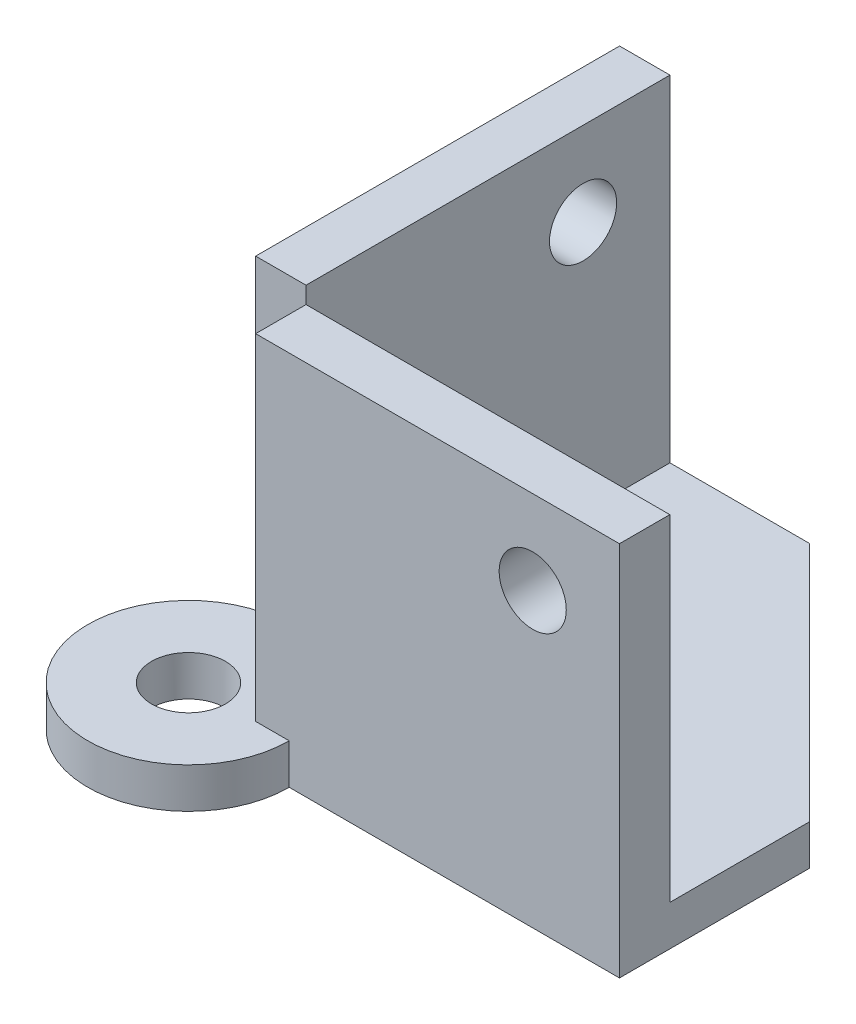
ISO-10303-21;
HEADER;
FILE_DESCRIPTION(('STEP AP214'),'2;1');
FILE_NAME('part.step','',(''),(''),'','','');
FILE_SCHEMA(('AUTOMOTIVE_DESIGN { 1 0 10303 214 1 1 1 1 }'));
ENDSEC;
DATA;
#1=APPLICATION_CONTEXT('core data for automotive mechanical design processes');
#2=APPLICATION_PROTOCOL_DEFINITION('international standard','automotive_design',2000,#1);
#3=PRODUCT_CONTEXT('',#1,'mechanical');
#4=PRODUCT('Part','Part','',(#3));
#5=PRODUCT_RELATED_PRODUCT_CATEGORY('part','',(#4));
#6=PRODUCT_DEFINITION_FORMATION('','',#4);
#7=PRODUCT_DEFINITION_CONTEXT('part definition',#1,'design');
#8=PRODUCT_DEFINITION('design','',#6,#7);
#9=PRODUCT_DEFINITION_SHAPE('','',#8);
#10=(LENGTH_UNIT() NAMED_UNIT(*) SI_UNIT(.MILLI.,.METRE.));
#11=(NAMED_UNIT(*) PLANE_ANGLE_UNIT() SI_UNIT($,.RADIAN.));
#12=(NAMED_UNIT(*) SI_UNIT($,.STERADIAN.) SOLID_ANGLE_UNIT());
#13=UNCERTAINTY_MEASURE_WITH_UNIT(LENGTH_MEASURE(1.E-05),#10,'distance_accuracy_value','');
#14=(GEOMETRIC_REPRESENTATION_CONTEXT(3) GLOBAL_UNCERTAINTY_ASSIGNED_CONTEXT((#13)) GLOBAL_UNIT_ASSIGNED_CONTEXT((#10,
#11,#12)) REPRESENTATION_CONTEXT('',''));
#15=CARTESIAN_POINT('',(0.,0.,0.));
#16=DIRECTION('',(0.,0.,1.));
#17=DIRECTION('',(1.,0.,0.));
#18=AXIS2_PLACEMENT_3D('',#15,#16,#17);
#19=CARTESIAN_POINT('',(0.,20.,0.));
#20=DIRECTION('',(0.,-1.,0.));
#21=DIRECTION('',(0.,0.,-1.));
#22=AXIS2_PLACEMENT_3D('',#19,#20,#21);
#23=PLANE('',#22);
#24=DIRECTION('',(0.,0.,-1.));
#25=VECTOR('',#24,1.);
#26=CARTESIAN_POINT('',(-5.,20.,9.));
#27=LINE('',#26,#25);
#28=CARTESIAN_POINT('',(-5.,20.,9.));
#29=VERTEX_POINT('',#28);
#30=CARTESIAN_POINT('',(-5.,20.,5.99999999999999));
#31=VERTEX_POINT('',#30);
#32=EDGE_CURVE('E121',#29,#31,#27,.T.);
#33=ORIENTED_EDGE('',*,*,#32,.F.);
#34=DIRECTION('',(1.,0.,0.));
#35=VECTOR('',#34,1.);
#36=CARTESIAN_POINT('',(16.6668663889152,20.,9.00000000000002));
#37=LINE('',#36,#35);
#38=CARTESIAN_POINT('',(16.6668663889152,20.,9.00000000000002));
#39=VERTEX_POINT('',#38);
#40=EDGE_CURVE('E134',#29,#39,#37,.T.);
#41=ORIENTED_EDGE('',*,*,#40,.T.);
#42=DIRECTION('',(0.,0.,-1.));
#43=VECTOR('',#42,1.);
#44=CARTESIAN_POINT('',(16.6668663889152,20.,6.00000000000004));
#45=LINE('',#44,#43);
#46=CARTESIAN_POINT('',(16.6668663889152,20.,6.00000000000004));
#47=VERTEX_POINT('',#46);
#48=EDGE_CURVE('E145',#39,#47,#45,.T.);
#49=ORIENTED_EDGE('',*,*,#48,.T.);
#50=DIRECTION('',(-1.,0.,0.));
#51=VECTOR('',#50,1.);
#52=CARTESIAN_POINT('',(16.6668663889152,20.,6.00000000000004));
#53=LINE('',#52,#51);
#54=EDGE_CURVE('E137',#47,#31,#53,.T.);
#55=ORIENTED_EDGE('',*,*,#54,.T.);
#56=EDGE_LOOP('',(#33,#41,#49,#55));
#57=FACE_BOUND('',#56,.T.);
#58=ADVANCED_FACE('F34',(#57),#23,.F.);
#59=DIRECTION('',(-1.,0.,0.));
#60=VECTOR('',#59,1.);
#61=CARTESIAN_POINT('',(-9.,20.,4.99999999999999));
#62=LINE('',#61,#60);
#63=CARTESIAN_POINT('',(-6.,20.,4.99999999999999));
#64=VERTEX_POINT('',#63);
#65=CARTESIAN_POINT('',(-9.,20.,4.99999999999999));
#66=VERTEX_POINT('',#65);
#67=EDGE_CURVE('E138',#64,#66,#62,.T.);
#68=ORIENTED_EDGE('',*,*,#67,.F.);
#69=DIRECTION('',(0.,0.,-1.));
#70=VECTOR('',#69,1.);
#71=CARTESIAN_POINT('',(-6.,20.,5.99999999999999));
#72=LINE('',#71,#70);
#73=CARTESIAN_POINT('',(-6.,20.,-16.6732464439974));
#74=VERTEX_POINT('',#73);
#75=EDGE_CURVE('E156',#64,#74,#72,.T.);
#76=ORIENTED_EDGE('',*,*,#75,.T.);
#77=DIRECTION('',(-1.,0.,0.));
#78=VECTOR('',#77,1.);
#79=CARTESIAN_POINT('',(-6.,20.,-16.6732464439974));
#80=LINE('',#79,#78);
#81=CARTESIAN_POINT('',(-9.,20.,-16.6732464439974));
#82=VERTEX_POINT('',#81);
#83=EDGE_CURVE('E50',#74,#82,#80,.T.);
#84=ORIENTED_EDGE('',*,*,#83,.T.);
#85=DIRECTION('',(0.,0.,1.));
#86=VECTOR('',#85,1.);
#87=CARTESIAN_POINT('',(-9.,20.,8.99999999999999));
#88=LINE('',#87,#86);
#89=EDGE_CURVE('E159',#82,#66,#88,.T.);
#90=ORIENTED_EDGE('',*,*,#89,.T.);
#91=EDGE_LOOP('',(#68,#76,#84,#90));
#92=FACE_BOUND('',#91,.T.);
#93=ADVANCED_FACE('F250',(#92),#23,.F.);
#94=CARTESIAN_POINT('',(16.6668663889152,20.,6.00000000000004));
#95=DIRECTION('',(0.,0.,1.));
#96=DIRECTION('',(1.,0.,0.));
#97=AXIS2_PLACEMENT_3D('',#94,#95,#96);
#98=PLANE('',#97);
#99=CARTESIAN_POINT('',(11.5,15.,6.00000000000003));
#100=DIRECTION('',(0.,0.,1.));
#101=DIRECTION('',(1.,0.,0.));
#102=AXIS2_PLACEMENT_3D('',#99,#100,#101);
#103=CIRCLE('',#102,2.);
#104=CARTESIAN_POINT('',(13.5,15.,6.00000000000003));
#105=VERTEX_POINT('',#104);
#106=EDGE_CURVE('E182',#105,#105,#103,.T.);
#107=ORIENTED_EDGE('',*,*,#106,.T.);
#108=EDGE_LOOP('',(#107));
#109=FACE_BOUND('',#108,.T.);
#110=DIRECTION('',(0.,-1.,0.));
#111=VECTOR('',#110,1.);
#112=CARTESIAN_POINT('',(-5.,20.,5.99999999999999));
#113=LINE('',#112,#111);
#114=CARTESIAN_POINT('',(-5.,0.,5.99999999999999));
#115=VERTEX_POINT('',#114);
#116=EDGE_CURVE('E130',#31,#115,#113,.T.);
#117=ORIENTED_EDGE('',*,*,#116,.F.);
#118=ORIENTED_EDGE('',*,*,#54,.F.);
#119=DIRECTION('',(0.,-1.,0.));
#120=VECTOR('',#119,1.);
#121=CARTESIAN_POINT('',(16.6668663889152,20.,6.00000000000004));
#122=LINE('',#121,#120);
#123=CARTESIAN_POINT('',(16.6668663889152,0.,6.00000000000004));
#124=VERTEX_POINT('',#123);
#125=EDGE_CURVE('E169',#47,#124,#122,.T.);
#126=ORIENTED_EDGE('',*,*,#125,.T.);
#127=DIRECTION('',(-1.,0.,0.));
#128=VECTOR('',#127,1.);
#129=CARTESIAN_POINT('',(16.6668663889152,0.,6.00000000000004));
#130=LINE('',#129,#128);
#131=EDGE_CURVE('E149',#124,#115,#130,.T.);
#132=ORIENTED_EDGE('',*,*,#131,.T.);
#133=EDGE_LOOP('',(#117,#118,#126,#132));
#134=FACE_BOUND('',#133,.T.);
#135=ADVANCED_FACE('F255',(#109,#134),#98,.F.);
#136=CARTESIAN_POINT('',(-6.,20.,5.99999999999999));
#137=DIRECTION('',(-1.,0.,0.));
#138=DIRECTION('',(0.,0.,1.));
#139=AXIS2_PLACEMENT_3D('',#136,#137,#138);
#140=PLANE('',#139);
#141=CARTESIAN_POINT('',(-6.,15.,-11.5));
#142=DIRECTION('',(-1.,0.,0.));
#143=DIRECTION('',(0.,0.,1.));
#144=AXIS2_PLACEMENT_3D('',#141,#142,#143);
#145=CIRCLE('',#144,1.99999999999999);
#146=CARTESIAN_POINT('',(-6.,15.,-9.5));
#147=VERTEX_POINT('',#146);
#148=EDGE_CURVE('E186',#147,#147,#145,.T.);
#149=ORIENTED_EDGE('',*,*,#148,.T.);
#150=EDGE_LOOP('',(#149));
#151=FACE_BOUND('',#150,.T.);
#152=DIRECTION('',(0.,1.,0.));
#153=VECTOR('',#152,1.);
#154=CARTESIAN_POINT('',(-6.,20.,4.99999999999999));
#155=LINE('',#154,#153);
#156=CARTESIAN_POINT('',(-6.,0.,4.99999999999999));
#157=VERTEX_POINT('',#156);
#158=EDGE_CURVE('E435',#157,#64,#155,.T.);
#159=ORIENTED_EDGE('',*,*,#158,.F.);
#160=DIRECTION('',(0.,0.,-1.));
#161=VECTOR('',#160,1.);
#162=CARTESIAN_POINT('',(-6.,0.,5.99999999999999));
#163=LINE('',#162,#161);
#164=CARTESIAN_POINT('',(-6.,0.,-16.6732464439974));
#165=VERTEX_POINT('',#164);
#166=EDGE_CURVE('E146',#157,#165,#163,.T.);
#167=ORIENTED_EDGE('',*,*,#166,.T.);
#168=DIRECTION('',(0.,-1.,0.));
#169=VECTOR('',#168,1.);
#170=CARTESIAN_POINT('',(-6.,20.,-16.6732464439974));
#171=LINE('',#170,#169);
#172=EDGE_CURVE('E166',#74,#165,#171,.T.);
#173=ORIENTED_EDGE('',*,*,#172,.F.);
#174=ORIENTED_EDGE('',*,*,#75,.F.);
#175=EDGE_LOOP('',(#159,#167,#173,#174));
#176=FACE_BOUND('',#175,.T.);
#177=ADVANCED_FACE('F260',(#151,#176),#140,.F.);
#178=CARTESIAN_POINT('',(-9.,-2.4,8.99999999999999));
#179=DIRECTION('',(1.,0.,0.));
#180=DIRECTION('',(0.,0.,-1.));
#181=AXIS2_PLACEMENT_3D('',#178,#179,#180);
#182=PLANE('',#181);
#183=CARTESIAN_POINT('',(-9.,15.,-11.5));
#184=DIRECTION('',(1.,0.,0.));
#185=DIRECTION('',(0.,0.,-1.));
#186=AXIS2_PLACEMENT_3D('',#183,#184,#185);
#187=CIRCLE('',#186,1.99999999999999);
#188=CARTESIAN_POINT('',(-9.,15.,-13.5));
#189=VERTEX_POINT('',#188);
#190=EDGE_CURVE('E185',#189,#189,#187,.T.);
#191=ORIENTED_EDGE('',*,*,#190,.T.);
#192=EDGE_LOOP('',(#191));
#193=FACE_BOUND('',#192,.T.);
#194=DIRECTION('',(0.,-1.,0.));
#195=VECTOR('',#194,1.);
#196=CARTESIAN_POINT('',(-9.,20.,4.99999999999999));
#197=LINE('',#196,#195);
#198=CARTESIAN_POINT('',(-9.,0.,4.99999999999999));
#199=VERTEX_POINT('',#198);
#200=EDGE_CURVE('E129',#66,#199,#197,.T.);
#201=ORIENTED_EDGE('',*,*,#200,.F.);
#202=ORIENTED_EDGE('',*,*,#89,.F.);
#203=DIRECTION('',(0.,-1.,0.));
#204=VECTOR('',#203,1.);
#205=CARTESIAN_POINT('',(-9.,20.,-16.6732464439974));
#206=LINE('',#205,#204);
#207=CARTESIAN_POINT('',(-9.,-2.4,-16.6732464439974));
#208=VERTEX_POINT('',#207);
#209=EDGE_CURVE('E161',#82,#208,#206,.T.);
#210=ORIENTED_EDGE('',*,*,#209,.T.);
#211=DIRECTION('',(0.,0.,-1.));
#212=VECTOR('',#211,1.);
#213=CARTESIAN_POINT('',(-9.,-2.4,8.99999999999999));
#214=LINE('',#213,#212);
#215=CARTESIAN_POINT('',(-9.,-2.4,2.99999999999999));
#216=VERTEX_POINT('',#215);
#217=EDGE_CURVE('E173',#216,#208,#214,.T.);
#218=ORIENTED_EDGE('',*,*,#217,.F.);
#219=DIRECTION('',(0.,-1.,0.));
#220=VECTOR('',#219,1.);
#221=CARTESIAN_POINT('',(-9.,0.,2.99999999999999));
#222=LINE('',#221,#220);
#223=CARTESIAN_POINT('',(-9.,0.,2.99999999999999));
#224=VERTEX_POINT('',#223);
#225=EDGE_CURVE('E213',#216,#224,#222,.F.);
#226=ORIENTED_EDGE('',*,*,#225,.T.);
#227=DIRECTION('',(0.,0.,-1.));
#228=VECTOR('',#227,1.);
#229=CARTESIAN_POINT('',(-9.,0.,8.99999999999999));
#230=LINE('',#229,#228);
#231=EDGE_CURVE('E217',#199,#224,#230,.T.);
#232=ORIENTED_EDGE('',*,*,#231,.F.);
#233=EDGE_LOOP('',(#201,#202,#210,#218,#226,#232));
#234=FACE_BOUND('',#233,.T.);
#235=ADVANCED_FACE('F231',(#193,#234),#182,.F.);
#236=CARTESIAN_POINT('',(28.,-2.4,9.));
#237=DIRECTION('',(0.,0.,-1.));
#238=DIRECTION('',(-1.,0.,0.));
#239=AXIS2_PLACEMENT_3D('',#236,#237,#238);
#240=PLANE('',#239);
#241=CARTESIAN_POINT('',(11.5,15.,8.99999999999999));
#242=DIRECTION('',(0.,0.,-1.));
#243=DIRECTION('',(-1.,0.,0.));
#244=AXIS2_PLACEMENT_3D('',#241,#242,#243);
#245=CIRCLE('',#244,2.);
#246=CARTESIAN_POINT('',(9.5,15.,8.99999999999999));
#247=VERTEX_POINT('',#246);
#248=EDGE_CURVE('E152',#247,#247,#245,.T.);
#249=ORIENTED_EDGE('',*,*,#248,.T.);
#250=EDGE_LOOP('',(#249));
#251=FACE_BOUND('',#250,.T.);
#252=DIRECTION('',(0.,-1.,0.));
#253=VECTOR('',#252,1.);
#254=CARTESIAN_POINT('',(-5.,20.,8.99999999999999));
#255=LINE('',#254,#253);
#256=CARTESIAN_POINT('',(-5.,0.,9.));
#257=VERTEX_POINT('',#256);
#258=EDGE_CURVE('E118',#257,#29,#255,.F.);
#259=ORIENTED_EDGE('',*,*,#258,.F.);
#260=DIRECTION('',(-1.,0.,0.));
#261=VECTOR('',#260,1.);
#262=CARTESIAN_POINT('',(28.,0.,9.));
#263=LINE('',#262,#261);
#264=CARTESIAN_POINT('',(-3.,0.,8.99999999999999));
#265=VERTEX_POINT('',#264);
#266=EDGE_CURVE('E191',#265,#257,#263,.T.);
#267=ORIENTED_EDGE('',*,*,#266,.F.);
#268=DIRECTION('',(0.,-1.,0.));
#269=VECTOR('',#268,1.);
#270=CARTESIAN_POINT('',(-3.,0.,8.99999999999999));
#271=LINE('',#270,#269);
#272=CARTESIAN_POINT('',(-3.,-2.4,8.99999999999999));
#273=VERTEX_POINT('',#272);
#274=EDGE_CURVE('E43',#265,#273,#271,.T.);
#275=ORIENTED_EDGE('',*,*,#274,.T.);
#276=DIRECTION('',(-1.,0.,0.));
#277=VECTOR('',#276,1.);
#278=CARTESIAN_POINT('',(28.,-2.4,9.));
#279=LINE('',#278,#277);
#280=CARTESIAN_POINT('',(16.6668663889152,-2.4,9.));
#281=VERTEX_POINT('',#280);
#282=EDGE_CURVE('E178',#281,#273,#279,.T.);
#283=ORIENTED_EDGE('',*,*,#282,.F.);
#284=DIRECTION('',(0.,-1.,0.));
#285=VECTOR('',#284,1.);
#286=CARTESIAN_POINT('',(16.6668663889152,20.,9.00000000000002));
#287=LINE('',#286,#285);
#288=EDGE_CURVE('E144',#39,#281,#287,.T.);
#289=ORIENTED_EDGE('',*,*,#288,.F.);
#290=ORIENTED_EDGE('',*,*,#40,.F.);
#291=EDGE_LOOP('',(#259,#267,#275,#283,#289,#290));
#292=FACE_BOUND('',#291,.T.);
#293=ADVANCED_FACE('F142',(#251,#292),#240,.F.);
#294=CARTESIAN_POINT('',(-9.,-2.4,8.99999999999999));
#295=DIRECTION('',(0.,1.,0.));
#296=DIRECTION('',(0.,0.,1.));
#297=AXIS2_PLACEMENT_3D('',#294,#295,#296);
#298=CYLINDRICAL_SURFACE('',#297,2.2);
#299=CARTESIAN_POINT('',(-9.,-2.4,8.99999999999999));
#300=DIRECTION('',(0.,1.,0.));
#301=DIRECTION('',(0.,0.,1.));
#302=AXIS2_PLACEMENT_3D('',#299,#300,#301);
#303=CIRCLE('',#302,2.2);
#304=CARTESIAN_POINT('',(-9.,-2.4,11.2));
#305=VERTEX_POINT('',#304);
#306=EDGE_CURVE('E449',#305,#305,#303,.T.);
#307=ORIENTED_EDGE('',*,*,#306,.F.);
#308=EDGE_LOOP('',(#307));
#309=FACE_BOUND('',#308,.T.);
#310=CARTESIAN_POINT('',(-9.,0.,8.99999999999999));
#311=DIRECTION('',(0.,-1.,0.));
#312=DIRECTION('',(0.,0.,-1.));
#313=AXIS2_PLACEMENT_3D('',#310,#311,#312);
#314=CIRCLE('',#313,2.2);
#315=CARTESIAN_POINT('',(-9.,0.,6.79999999999999));
#316=VERTEX_POINT('',#315);
#317=EDGE_CURVE('E12',#316,#316,#314,.T.);
#318=ORIENTED_EDGE('',*,*,#317,.F.);
#319=EDGE_LOOP('',(#318));
#320=FACE_BOUND('',#319,.T.);
#321=ADVANCED_FACE('F277',(#309,#320),#298,.F.);
#322=CARTESIAN_POINT('',(19.,5.,0.));
#323=DIRECTION('',(-0.707106781186548,0.,0.707106781186548));
#324=DIRECTION('',(0.707106781186548,0.,0.707106781186548));
#325=AXIS2_PLACEMENT_3D('',#322,#323,#324);
#326=PLANE('',#325);
#327=DIRECTION('',(-0.707106781186548,0.,-0.707106781186548));
#328=VECTOR('',#327,1.);
#329=CARTESIAN_POINT('',(1.70710678118655,0.,-17.2928932188135));
#330=LINE('',#329,#328);
#331=CARTESIAN_POINT('',(16.6668663889152,0.,-2.33313361108475));
#332=VERTEX_POINT('',#331);
#333=CARTESIAN_POINT('',(2.32675355600259,0.,-16.6732464439974));
#334=VERTEX_POINT('',#333);
#335=EDGE_CURVE('E211',#332,#334,#330,.T.);
#336=ORIENTED_EDGE('',*,*,#335,.F.);
#337=DIRECTION('',(0.,1.,0.));
#338=VECTOR('',#337,1.);
#339=CARTESIAN_POINT('',(16.6668663889152,-2.4,-2.33313361108475));
#340=LINE('',#339,#338);
#341=CARTESIAN_POINT('',(16.6668663889152,-2.4,-2.33313361108475));
#342=VERTEX_POINT('',#341);
#343=EDGE_CURVE('E207',#342,#332,#340,.T.);
#344=ORIENTED_EDGE('',*,*,#343,.F.);
#345=DIRECTION('',(0.707106781186548,0.,0.707106781186547));
#346=VECTOR('',#345,1.);
#347=CARTESIAN_POINT('',(-9.,-2.4,-28.));
#348=LINE('',#347,#346);
#349=CARTESIAN_POINT('',(2.32675355600259,-2.4,-16.6732464439974));
#350=VERTEX_POINT('',#349);
#351=EDGE_CURVE('E175',#350,#342,#348,.T.);
#352=ORIENTED_EDGE('',*,*,#351,.F.);
#353=DIRECTION('',(0.,1.,0.));
#354=VECTOR('',#353,1.);
#355=CARTESIAN_POINT('',(2.32675355600259,-2.4,-16.6732464439974));
#356=LINE('',#355,#354);
#357=EDGE_CURVE('E212',#350,#334,#356,.T.);
#358=ORIENTED_EDGE('',*,*,#357,.T.);
#359=EDGE_LOOP('',(#336,#344,#352,#358));
#360=FACE_BOUND('',#359,.T.);
#361=ADVANCED_FACE('F36',(#360),#326,.F.);
#362=CARTESIAN_POINT('',(0.,0.,0.));
#363=DIRECTION('',(0.,1.,0.));
#364=DIRECTION('',(0.,0.,1.));
#365=AXIS2_PLACEMENT_3D('',#362,#363,#364);
#366=PLANE('',#365);
#367=DIRECTION('',(0.,0.,-1.));
#368=VECTOR('',#367,1.);
#369=CARTESIAN_POINT('',(-5.,0.,9.));
#370=LINE('',#369,#368);
#371=EDGE_CURVE('E124',#257,#115,#370,.T.);
#372=ORIENTED_EDGE('',*,*,#371,.T.);
#373=ORIENTED_EDGE('',*,*,#131,.F.);
#374=DIRECTION('',(0.,0.,-1.));
#375=VECTOR('',#374,1.);
#376=CARTESIAN_POINT('',(16.6668663889152,0.,0.));
#377=LINE('',#376,#375);
#378=EDGE_CURVE('E189',#124,#332,#377,.T.);
#379=ORIENTED_EDGE('',*,*,#378,.T.);
#380=ORIENTED_EDGE('',*,*,#335,.T.);
#381=DIRECTION('',(-1.,0.,0.));
#382=VECTOR('',#381,1.);
#383=CARTESIAN_POINT('',(0.,0.,-16.6732464439974));
#384=LINE('',#383,#382);
#385=EDGE_CURVE('E222',#334,#165,#384,.T.);
#386=ORIENTED_EDGE('',*,*,#385,.T.);
#387=ORIENTED_EDGE('',*,*,#166,.F.);
#388=DIRECTION('',(-1.,0.,0.));
#389=VECTOR('',#388,1.);
#390=CARTESIAN_POINT('',(-9.,0.,4.99999999999999));
#391=LINE('',#390,#389);
#392=EDGE_CURVE('E139',#157,#199,#391,.T.);
#393=ORIENTED_EDGE('',*,*,#392,.T.);
#394=ORIENTED_EDGE('',*,*,#231,.T.);
#395=CARTESIAN_POINT('',(-9.,0.,8.99999999999999));
#396=DIRECTION('',(0.,-1.,0.));
#397=DIRECTION('',(0.,0.,-1.));
#398=AXIS2_PLACEMENT_3D('',#395,#396,#397);
#399=CIRCLE('',#398,6.);
#400=EDGE_CURVE('E455',#265,#224,#399,.T.);
#401=ORIENTED_EDGE('',*,*,#400,.F.);
#402=ORIENTED_EDGE('',*,*,#266,.T.);
#403=EDGE_LOOP('',(#372,#373,#379,#380,#386,#387,#393,#394,#401,#402));
#404=FACE_BOUND('',#403,.T.);
#405=ORIENTED_EDGE('',*,*,#317,.T.);
#406=EDGE_LOOP('',(#405));
#407=FACE_BOUND('',#406,.T.);
#408=ADVANCED_FACE('F271',(#404,#407),#366,.T.);
#409=CARTESIAN_POINT('',(0.,-2.4,0.));
#410=DIRECTION('',(0.,1.,0.));
#411=DIRECTION('',(0.,0.,1.));
#412=AXIS2_PLACEMENT_3D('',#409,#410,#411);
#413=PLANE('',#412);
#414=ORIENTED_EDGE('',*,*,#306,.T.);
#415=EDGE_LOOP('',(#414));
#416=FACE_BOUND('',#415,.T.);
#417=ORIENTED_EDGE('',*,*,#282,.T.);
#418=CARTESIAN_POINT('',(-9.,-2.4,8.99999999999999));
#419=DIRECTION('',(0.,-1.,0.));
#420=DIRECTION('',(0.,0.,-1.));
#421=AXIS2_PLACEMENT_3D('',#418,#419,#420);
#422=CIRCLE('',#421,6.);
#423=EDGE_CURVE('E199',#273,#216,#422,.T.);
#424=ORIENTED_EDGE('',*,*,#423,.T.);
#425=ORIENTED_EDGE('',*,*,#217,.T.);
#426=DIRECTION('',(-1.,0.,0.));
#427=VECTOR('',#426,1.);
#428=CARTESIAN_POINT('',(0.,-2.4,-16.6732464439974));
#429=LINE('',#428,#427);
#430=EDGE_CURVE('E225',#350,#208,#429,.T.);
#431=ORIENTED_EDGE('',*,*,#430,.F.);
#432=ORIENTED_EDGE('',*,*,#351,.T.);
#433=DIRECTION('',(0.,0.,-1.));
#434=VECTOR('',#433,1.);
#435=CARTESIAN_POINT('',(16.6668663889152,-2.4,0.));
#436=LINE('',#435,#434);
#437=EDGE_CURVE('E181',#281,#342,#436,.T.);
#438=ORIENTED_EDGE('',*,*,#437,.F.);
#439=EDGE_LOOP('',(#417,#424,#425,#431,#432,#438));
#440=FACE_BOUND('',#439,.T.);
#441=ADVANCED_FACE('F198',(#416,#440),#413,.F.);
#442=CARTESIAN_POINT('',(16.6668663889152,20.,6.00000000000004));
#443=DIRECTION('',(-1.,0.,0.));
#444=DIRECTION('',(0.,0.,1.));
#445=AXIS2_PLACEMENT_3D('',#442,#443,#444);
#446=PLANE('',#445);
#447=ORIENTED_EDGE('',*,*,#288,.T.);
#448=ORIENTED_EDGE('',*,*,#437,.T.);
#449=ORIENTED_EDGE('',*,*,#343,.T.);
#450=ORIENTED_EDGE('',*,*,#378,.F.);
#451=ORIENTED_EDGE('',*,*,#125,.F.);
#452=ORIENTED_EDGE('',*,*,#48,.F.);
#453=EDGE_LOOP('',(#447,#448,#449,#450,#451,#452));
#454=FACE_BOUND('',#453,.T.);
#455=ADVANCED_FACE('F205',(#454),#446,.F.);
#456=CARTESIAN_POINT('',(-6.,20.,-16.6732464439974));
#457=DIRECTION('',(0.,0.,1.));
#458=DIRECTION('',(1.,0.,0.));
#459=AXIS2_PLACEMENT_3D('',#456,#457,#458);
#460=PLANE('',#459);
#461=ORIENTED_EDGE('',*,*,#172,.T.);
#462=ORIENTED_EDGE('',*,*,#385,.F.);
#463=ORIENTED_EDGE('',*,*,#357,.F.);
#464=ORIENTED_EDGE('',*,*,#430,.T.);
#465=ORIENTED_EDGE('',*,*,#209,.F.);
#466=ORIENTED_EDGE('',*,*,#83,.F.);
#467=EDGE_LOOP('',(#461,#462,#463,#464,#465,#466));
#468=FACE_BOUND('',#467,.T.);
#469=ADVANCED_FACE('F245',(#468),#460,.F.);
#470=CARTESIAN_POINT('',(11.5,15.,-28.000025));
#471=DIRECTION('',(0.,0.,1.));
#472=DIRECTION('',(1.,0.,0.));
#473=AXIS2_PLACEMENT_3D('',#470,#471,#472);
#474=CYLINDRICAL_SURFACE('',#473,2.);
#475=ORIENTED_EDGE('',*,*,#106,.F.);
#476=EDGE_LOOP('',(#475));
#477=FACE_BOUND('',#476,.T.);
#478=ORIENTED_EDGE('',*,*,#248,.F.);
#479=EDGE_LOOP('',(#478));
#480=FACE_BOUND('',#479,.T.);
#481=ADVANCED_FACE('F237',(#477,#480),#474,.F.);
#482=CARTESIAN_POINT('',(28.000025,15.,-11.5));
#483=DIRECTION('',(-1.,0.,0.));
#484=DIRECTION('',(0.,0.,1.));
#485=AXIS2_PLACEMENT_3D('',#482,#483,#484);
#486=CYLINDRICAL_SURFACE('',#485,1.99999999999999);
#487=ORIENTED_EDGE('',*,*,#148,.F.);
#488=EDGE_LOOP('',(#487));
#489=FACE_BOUND('',#488,.T.);
#490=ORIENTED_EDGE('',*,*,#190,.F.);
#491=EDGE_LOOP('',(#490));
#492=FACE_BOUND('',#491,.T.);
#493=ADVANCED_FACE('F234',(#489,#492),#486,.F.);
#494=CARTESIAN_POINT('',(-9.,0.,8.99999999999999));
#495=DIRECTION('',(0.,-1.,0.));
#496=DIRECTION('',(0.,0.,-1.));
#497=AXIS2_PLACEMENT_3D('',#494,#495,#496);
#498=CYLINDRICAL_SURFACE('',#497,6.);
#499=ORIENTED_EDGE('',*,*,#225,.F.);
#500=ORIENTED_EDGE('',*,*,#423,.F.);
#501=ORIENTED_EDGE('',*,*,#274,.F.);
#502=ORIENTED_EDGE('',*,*,#400,.T.);
#503=EDGE_LOOP('',(#499,#500,#501,#502));
#504=FACE_BOUND('',#503,.T.);
#505=ADVANCED_FACE('F236',(#504),#498,.T.);
#506=CARTESIAN_POINT('',(-5.,20.,9.));
#507=DIRECTION('',(-1.,0.,0.));
#508=DIRECTION('',(0.,0.,1.));
#509=AXIS2_PLACEMENT_3D('',#506,#507,#508);
#510=PLANE('',#509);
#511=ORIENTED_EDGE('',*,*,#116,.T.);
#512=ORIENTED_EDGE('',*,*,#371,.F.);
#513=ORIENTED_EDGE('',*,*,#258,.T.);
#514=ORIENTED_EDGE('',*,*,#32,.T.);
#515=EDGE_LOOP('',(#511,#512,#513,#514));
#516=FACE_BOUND('',#515,.T.);
#517=ADVANCED_FACE('F120',(#516),#510,.T.);
#518=CARTESIAN_POINT('',(-9.,20.,4.99999999999999));
#519=DIRECTION('',(0.,0.,1.));
#520=DIRECTION('',(1.,0.,0.));
#521=AXIS2_PLACEMENT_3D('',#518,#519,#520);
#522=PLANE('',#521);
#523=ORIENTED_EDGE('',*,*,#158,.T.);
#524=ORIENTED_EDGE('',*,*,#67,.T.);
#525=ORIENTED_EDGE('',*,*,#200,.T.);
#526=ORIENTED_EDGE('',*,*,#392,.F.);
#527=EDGE_LOOP('',(#523,#524,#525,#526));
#528=FACE_BOUND('',#527,.T.);
#529=ADVANCED_FACE('F418',(#528),#522,.T.);
#530=CLOSED_SHELL('',(#58,#93,#135,#177,#235,#293,#321,#361,#408,#441,#455,#469,#481,#493,#505,
#517,#529));
#531=MANIFOLD_SOLID_BREP('B2',#530);
#532=ADVANCED_BREP_SHAPE_REPRESENTATION('',(#18,#531),#14);
#533=SHAPE_DEFINITION_REPRESENTATION(#9,#532);
ENDSEC;
END-ISO-10303-21;
